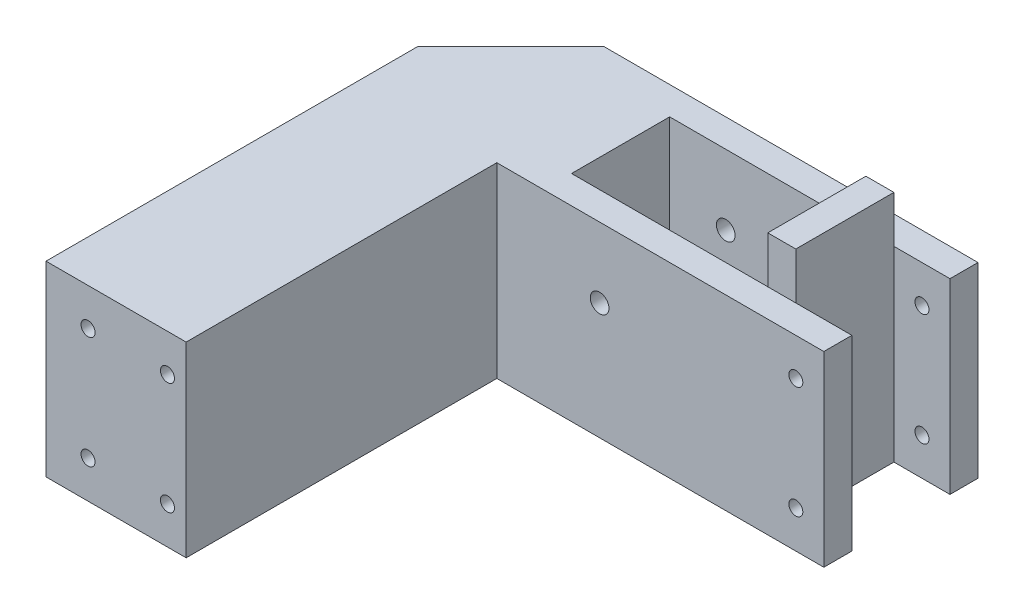
ISO-10303-21;
HEADER;
FILE_DESCRIPTION(('STEP AP214'),'2;1');
FILE_NAME('part.step','',(''),(''),'','','');
FILE_SCHEMA(('AUTOMOTIVE_DESIGN { 1 0 10303 214 1 1 1 1 }'));
ENDSEC;
DATA;
#1=APPLICATION_CONTEXT('core data for automotive mechanical design processes');
#2=APPLICATION_PROTOCOL_DEFINITION('international standard','automotive_design',2000,#1);
#3=PRODUCT_CONTEXT('',#1,'mechanical');
#4=PRODUCT('Part','Part','',(#3));
#5=PRODUCT_RELATED_PRODUCT_CATEGORY('part','',(#4));
#6=PRODUCT_DEFINITION_FORMATION('','',#4);
#7=PRODUCT_DEFINITION_CONTEXT('part definition',#1,'design');
#8=PRODUCT_DEFINITION('design','',#6,#7);
#9=PRODUCT_DEFINITION_SHAPE('','',#8);
#10=(LENGTH_UNIT() NAMED_UNIT(*) SI_UNIT(.MILLI.,.METRE.));
#11=(NAMED_UNIT(*) PLANE_ANGLE_UNIT() SI_UNIT($,.RADIAN.));
#12=(NAMED_UNIT(*) SI_UNIT($,.STERADIAN.) SOLID_ANGLE_UNIT());
#13=UNCERTAINTY_MEASURE_WITH_UNIT(LENGTH_MEASURE(1.E-05),#10,'distance_accuracy_value','');
#14=(GEOMETRIC_REPRESENTATION_CONTEXT(3) GLOBAL_UNCERTAINTY_ASSIGNED_CONTEXT((#13)) GLOBAL_UNIT_ASSIGNED_CONTEXT((#10,
#11,#12)) REPRESENTATION_CONTEXT('',''));
#15=CARTESIAN_POINT('',(0.,0.,0.));
#16=DIRECTION('',(0.,0.,1.));
#17=DIRECTION('',(1.,0.,0.));
#18=AXIS2_PLACEMENT_3D('',#15,#16,#17);
#19=CARTESIAN_POINT('',(20.,40.,-6.));
#20=DIRECTION('',(0.,0.,1.));
#21=DIRECTION('',(1.,0.,0.));
#22=AXIS2_PLACEMENT_3D('',#19,#20,#21);
#23=PLANE('',#22);
#24=CARTESIAN_POINT('',(32.,25.,-6.));
#25=DIRECTION('',(0.,0.,1.));
#26=DIRECTION('',(1.,0.,0.));
#27=AXIS2_PLACEMENT_3D('',#24,#25,#26);
#28=CIRCLE('',#27,2.);
#29=CARTESIAN_POINT('',(34.,25.,-6.));
#30=VERTEX_POINT('',#29);
#31=EDGE_CURVE('E188',#30,#30,#28,.T.);
#32=ORIENTED_EDGE('',*,*,#31,.T.);
#33=EDGE_LOOP('',(#32));
#34=FACE_BOUND('',#33,.T.);
#35=DIRECTION('',(0.,1.,0.));
#36=VECTOR('',#35,1.);
#37=CARTESIAN_POINT('',(62.,-21.8403296678416,-6.));
#38=LINE('',#37,#36);
#39=CARTESIAN_POINT('',(62.,0.,-6.));
#40=VERTEX_POINT('',#39);
#41=CARTESIAN_POINT('',(62.,40.,-6.));
#42=VERTEX_POINT('',#41);
#43=EDGE_CURVE('E175',#40,#42,#38,.T.);
#44=ORIENTED_EDGE('',*,*,#43,.F.);
#45=DIRECTION('',(-1.,0.,0.));
#46=VECTOR('',#45,1.);
#47=CARTESIAN_POINT('',(20.,0.,-6.));
#48=LINE('',#47,#46);
#49=CARTESIAN_POINT('',(20.,0.,-6.));
#50=VERTEX_POINT('',#49);
#51=EDGE_CURVE('E317',#40,#50,#48,.T.);
#52=ORIENTED_EDGE('',*,*,#51,.T.);
#53=DIRECTION('',(0.,-1.,0.));
#54=VECTOR('',#53,1.);
#55=CARTESIAN_POINT('',(20.,40.,-6.));
#56=LINE('',#55,#54);
#57=CARTESIAN_POINT('',(20.,40.,-6.));
#58=VERTEX_POINT('',#57);
#59=EDGE_CURVE('E337',#58,#50,#56,.T.);
#60=ORIENTED_EDGE('',*,*,#59,.F.);
#61=DIRECTION('',(-1.,0.,0.));
#62=VECTOR('',#61,1.);
#63=CARTESIAN_POINT('',(20.,40.,-6.));
#64=LINE('',#63,#62);
#65=EDGE_CURVE('E300',#42,#58,#64,.T.);
#66=ORIENTED_EDGE('',*,*,#65,.F.);
#67=EDGE_LOOP('',(#44,#52,#60,#66));
#68=FACE_BOUND('',#67,.T.);
#69=ADVANCED_FACE('F41',(#34,#68),#23,.F.);
#70=CARTESIAN_POINT('',(80.,40.,-27.0000000000001));
#71=DIRECTION('',(0.,0.,-1.));
#72=DIRECTION('',(-1.,0.,0.));
#73=AXIS2_PLACEMENT_3D('',#70,#71,#72);
#74=PLANE('',#73);
#75=CARTESIAN_POINT('',(74.,8.,-27.0000000000001));
#76=DIRECTION('',(0.,0.,-1.));
#77=DIRECTION('',(-1.,0.,0.));
#78=AXIS2_PLACEMENT_3D('',#75,#76,#77);
#79=CIRCLE('',#78,1.5);
#80=CARTESIAN_POINT('',(72.5,8.,-27.0000000000001));
#81=VERTEX_POINT('',#80);
#82=EDGE_CURVE('E279',#81,#81,#79,.T.);
#83=ORIENTED_EDGE('',*,*,#82,.T.);
#84=EDGE_LOOP('',(#83));
#85=FACE_BOUND('',#84,.T.);
#86=CARTESIAN_POINT('',(74.,32.,-27.0000000000001));
#87=DIRECTION('',(0.,0.,-1.));
#88=DIRECTION('',(-1.,0.,0.));
#89=AXIS2_PLACEMENT_3D('',#86,#87,#88);
#90=CIRCLE('',#89,1.5);
#91=CARTESIAN_POINT('',(72.5,32.,-27.0000000000001));
#92=VERTEX_POINT('',#91);
#93=EDGE_CURVE('E284',#92,#92,#90,.T.);
#94=ORIENTED_EDGE('',*,*,#93,.T.);
#95=EDGE_LOOP('',(#94));
#96=FACE_BOUND('',#95,.T.);
#97=DIRECTION('',(0.,1.,0.));
#98=VECTOR('',#97,1.);
#99=CARTESIAN_POINT('',(68.,-21.8403296678416,-27.0000000000001));
#100=LINE('',#99,#98);
#101=CARTESIAN_POINT('',(68.,0.,-27.0000000000001));
#102=VERTEX_POINT('',#101);
#103=CARTESIAN_POINT('',(68.,40.,-27.0000000000001));
#104=VERTEX_POINT('',#103);
#105=EDGE_CURVE('E206',#102,#104,#100,.T.);
#106=ORIENTED_EDGE('',*,*,#105,.F.);
#107=DIRECTION('',(1.,0.,0.));
#108=VECTOR('',#107,1.);
#109=CARTESIAN_POINT('',(80.,0.,-27.0000000000001));
#110=LINE('',#109,#108);
#111=CARTESIAN_POINT('',(80.,0.,-27.0000000000001));
#112=VERTEX_POINT('',#111);
#113=EDGE_CURVE('E323',#102,#112,#110,.T.);
#114=ORIENTED_EDGE('',*,*,#113,.T.);
#115=DIRECTION('',(0.,-1.,0.));
#116=VECTOR('',#115,1.);
#117=CARTESIAN_POINT('',(80.,40.,-27.0000000000001));
#118=LINE('',#117,#116);
#119=CARTESIAN_POINT('',(80.,40.,-27.0000000000001));
#120=VERTEX_POINT('',#119);
#121=EDGE_CURVE('E329',#120,#112,#118,.T.);
#122=ORIENTED_EDGE('',*,*,#121,.F.);
#123=DIRECTION('',(1.,0.,0.));
#124=VECTOR('',#123,1.);
#125=CARTESIAN_POINT('',(80.,40.,-27.0000000000001));
#126=LINE('',#125,#124);
#127=EDGE_CURVE('E303',#104,#120,#126,.T.);
#128=ORIENTED_EDGE('',*,*,#127,.F.);
#129=EDGE_LOOP('',(#106,#114,#122,#128));
#130=FACE_BOUND('',#129,.T.);
#131=ADVANCED_FACE('F376',(#85,#96,#130),#74,.F.);
#132=CARTESIAN_POINT('',(0.,40.,0.));
#133=DIRECTION('',(0.,0.,-1.));
#134=DIRECTION('',(-1.,0.,0.));
#135=AXIS2_PLACEMENT_3D('',#132,#133,#134);
#136=PLANE('',#135);
#137=CARTESIAN_POINT('',(32.,25.,0.));
#138=DIRECTION('',(0.,0.,1.));
#139=DIRECTION('',(1.,0.,0.));
#140=AXIS2_PLACEMENT_3D('',#137,#138,#139);
#141=CIRCLE('',#140,2.);
#142=CARTESIAN_POINT('',(34.,25.,0.));
#143=VERTEX_POINT('',#142);
#144=EDGE_CURVE('E620',#143,#143,#141,.T.);
#145=ORIENTED_EDGE('',*,*,#144,.F.);
#146=EDGE_LOOP('',(#145));
#147=FACE_BOUND('',#146,.T.);
#148=CARTESIAN_POINT('',(74.,32.,0.));
#149=DIRECTION('',(0.,0.,-1.));
#150=DIRECTION('',(-1.,0.,0.));
#151=AXIS2_PLACEMENT_3D('',#148,#149,#150);
#152=CIRCLE('',#151,1.5);
#153=CARTESIAN_POINT('',(72.5,32.,0.));
#154=VERTEX_POINT('',#153);
#155=EDGE_CURVE('E268',#154,#154,#152,.T.);
#156=ORIENTED_EDGE('',*,*,#155,.T.);
#157=EDGE_LOOP('',(#156));
#158=FACE_BOUND('',#157,.T.);
#159=CARTESIAN_POINT('',(74.,8.,0.));
#160=DIRECTION('',(0.,0.,-1.));
#161=DIRECTION('',(-1.,0.,0.));
#162=AXIS2_PLACEMENT_3D('',#159,#160,#161);
#163=CIRCLE('',#162,1.5);
#164=CARTESIAN_POINT('',(72.5,8.,0.));
#165=VERTEX_POINT('',#164);
#166=EDGE_CURVE('E274',#165,#165,#163,.T.);
#167=ORIENTED_EDGE('',*,*,#166,.T.);
#168=EDGE_LOOP('',(#167));
#169=FACE_BOUND('',#168,.T.);
#170=DIRECTION('',(1.,0.,0.));
#171=VECTOR('',#170,1.);
#172=CARTESIAN_POINT('',(0.,40.,0.));
#173=LINE('',#172,#171);
#174=CARTESIAN_POINT('',(10.,40.,0.));
#175=VERTEX_POINT('',#174);
#176=CARTESIAN_POINT('',(80.,40.,0.));
#177=VERTEX_POINT('',#176);
#178=EDGE_CURVE('E292',#175,#177,#173,.T.);
#179=ORIENTED_EDGE('',*,*,#178,.F.);
#180=DIRECTION('',(0.,-1.,0.));
#181=VECTOR('',#180,1.);
#182=CARTESIAN_POINT('',(10.,40.,0.));
#183=LINE('',#182,#181);
#184=CARTESIAN_POINT('',(10.,0.,0.));
#185=VERTEX_POINT('',#184);
#186=EDGE_CURVE('E11',#175,#185,#183,.T.);
#187=ORIENTED_EDGE('',*,*,#186,.T.);
#188=DIRECTION('',(1.,0.,0.));
#189=VECTOR('',#188,1.);
#190=CARTESIAN_POINT('',(0.,0.,0.));
#191=LINE('',#190,#189);
#192=CARTESIAN_POINT('',(80.,0.,0.));
#193=VERTEX_POINT('',#192);
#194=EDGE_CURVE('E293',#185,#193,#191,.T.);
#195=ORIENTED_EDGE('',*,*,#194,.T.);
#196=DIRECTION('',(0.,-1.,0.));
#197=VECTOR('',#196,1.);
#198=CARTESIAN_POINT('',(80.,40.,0.));
#199=LINE('',#198,#197);
#200=EDGE_CURVE('E49',#177,#193,#199,.T.);
#201=ORIENTED_EDGE('',*,*,#200,.F.);
#202=EDGE_LOOP('',(#179,#187,#195,#201));
#203=FACE_BOUND('',#202,.T.);
#204=ADVANCED_FACE('F43',(#147,#158,#169,#203),#136,.F.);
#205=CARTESIAN_POINT('',(80.,40.,-6.));
#206=DIRECTION('',(-1.,0.,0.));
#207=DIRECTION('',(0.,0.,1.));
#208=AXIS2_PLACEMENT_3D('',#205,#206,#207);
#209=PLANE('',#208);
#210=DIRECTION('',(0.,0.,-1.));
#211=VECTOR('',#210,1.);
#212=CARTESIAN_POINT('',(80.,0.,-6.));
#213=LINE('',#212,#211);
#214=CARTESIAN_POINT('',(80.,0.,-6.));
#215=VERTEX_POINT('',#214);
#216=EDGE_CURVE('E313',#193,#215,#213,.T.);
#217=ORIENTED_EDGE('',*,*,#216,.T.);
#218=DIRECTION('',(0.,-1.,0.));
#219=VECTOR('',#218,1.);
#220=CARTESIAN_POINT('',(80.,40.,-6.));
#221=LINE('',#220,#219);
#222=CARTESIAN_POINT('',(80.,40.,-6.));
#223=VERTEX_POINT('',#222);
#224=EDGE_CURVE('E339',#223,#215,#221,.T.);
#225=ORIENTED_EDGE('',*,*,#224,.F.);
#226=DIRECTION('',(0.,0.,-1.));
#227=VECTOR('',#226,1.);
#228=CARTESIAN_POINT('',(80.,40.,-6.));
#229=LINE('',#228,#227);
#230=EDGE_CURVE('E295',#177,#223,#229,.T.);
#231=ORIENTED_EDGE('',*,*,#230,.F.);
#232=ORIENTED_EDGE('',*,*,#200,.T.);
#233=EDGE_LOOP('',(#217,#225,#231,#232));
#234=FACE_BOUND('',#233,.T.);
#235=ADVANCED_FACE('F395',(#234),#209,.F.);
#236=CARTESIAN_POINT('',(74.,32.,-6.));
#237=DIRECTION('',(0.,0.,1.));
#238=DIRECTION('',(1.,0.,0.));
#239=AXIS2_PLACEMENT_3D('',#236,#237,#238);
#240=CIRCLE('',#239,1.5);
#241=CARTESIAN_POINT('',(75.5,32.,-6.));
#242=VERTEX_POINT('',#241);
#243=EDGE_CURVE('E286',#242,#242,#240,.T.);
#244=ORIENTED_EDGE('',*,*,#243,.T.);
#245=EDGE_LOOP('',(#244));
#246=FACE_BOUND('',#245,.T.);
#247=CARTESIAN_POINT('',(74.,8.,-6.));
#248=DIRECTION('',(0.,0.,1.));
#249=DIRECTION('',(1.,0.,0.));
#250=AXIS2_PLACEMENT_3D('',#247,#248,#249);
#251=CIRCLE('',#250,1.5);
#252=CARTESIAN_POINT('',(75.5,8.,-6.));
#253=VERTEX_POINT('',#252);
#254=EDGE_CURVE('E285',#253,#253,#251,.T.);
#255=ORIENTED_EDGE('',*,*,#254,.T.);
#256=EDGE_LOOP('',(#255));
#257=FACE_BOUND('',#256,.T.);
#258=CARTESIAN_POINT('',(68.,0.,-6.));
#259=VERTEX_POINT('',#258);
#260=EDGE_CURVE('E320',#215,#259,#48,.T.);
#261=ORIENTED_EDGE('',*,*,#260,.T.);
#262=DIRECTION('',(0.,1.,0.));
#263=VECTOR('',#262,1.);
#264=CARTESIAN_POINT('',(68.,-21.8403296678416,-6.));
#265=LINE('',#264,#263);
#266=CARTESIAN_POINT('',(68.,40.,-6.));
#267=VERTEX_POINT('',#266);
#268=EDGE_CURVE('E66',#259,#267,#265,.T.);
#269=ORIENTED_EDGE('',*,*,#268,.T.);
#270=EDGE_CURVE('E296',#223,#267,#64,.T.);
#271=ORIENTED_EDGE('',*,*,#270,.F.);
#272=ORIENTED_EDGE('',*,*,#224,.T.);
#273=EDGE_LOOP('',(#261,#269,#271,#272));
#274=FACE_BOUND('',#273,.T.);
#275=ADVANCED_FACE('F378',(#246,#257,#274),#23,.F.);
#276=CARTESIAN_POINT('',(20.,40.,-27.0000000000001));
#277=DIRECTION('',(-1.,0.,0.));
#278=DIRECTION('',(0.,0.,1.));
#279=AXIS2_PLACEMENT_3D('',#276,#277,#278);
#280=PLANE('',#279);
#281=DIRECTION('',(0.,0.,-1.));
#282=VECTOR('',#281,1.);
#283=CARTESIAN_POINT('',(20.,0.,-27.0000000000001));
#284=LINE('',#283,#282);
#285=CARTESIAN_POINT('',(20.,0.,-27.0000000000001));
#286=VERTEX_POINT('',#285);
#287=EDGE_CURVE('E316',#50,#286,#284,.T.);
#288=ORIENTED_EDGE('',*,*,#287,.T.);
#289=DIRECTION('',(0.,-1.,0.));
#290=VECTOR('',#289,1.);
#291=CARTESIAN_POINT('',(20.,40.,-27.0000000000001));
#292=LINE('',#291,#290);
#293=CARTESIAN_POINT('',(20.,40.,-27.0000000000001));
#294=VERTEX_POINT('',#293);
#295=EDGE_CURVE('E331',#294,#286,#292,.T.);
#296=ORIENTED_EDGE('',*,*,#295,.F.);
#297=DIRECTION('',(0.,0.,-1.));
#298=VECTOR('',#297,1.);
#299=CARTESIAN_POINT('',(20.,40.,-27.0000000000001));
#300=LINE('',#299,#298);
#301=EDGE_CURVE('E297',#58,#294,#300,.T.);
#302=ORIENTED_EDGE('',*,*,#301,.F.);
#303=ORIENTED_EDGE('',*,*,#59,.T.);
#304=EDGE_LOOP('',(#288,#296,#302,#303));
#305=FACE_BOUND('',#304,.T.);
#306=ADVANCED_FACE('F391',(#305),#280,.F.);
#307=CARTESIAN_POINT('',(32.,25.,-27.0000000000001));
#308=DIRECTION('',(0.,0.,-1.));
#309=DIRECTION('',(-1.,0.,0.));
#310=AXIS2_PLACEMENT_3D('',#307,#308,#309);
#311=CIRCLE('',#310,2.);
#312=CARTESIAN_POINT('',(30.,25.,-27.0000000000001));
#313=VERTEX_POINT('',#312);
#314=EDGE_CURVE('E192',#313,#313,#311,.T.);
#315=ORIENTED_EDGE('',*,*,#314,.T.);
#316=EDGE_LOOP('',(#315));
#317=FACE_BOUND('',#316,.T.);
#318=CARTESIAN_POINT('',(62.,0.,-27.0000000000001));
#319=VERTEX_POINT('',#318);
#320=EDGE_CURVE('E324',#286,#319,#110,.T.);
#321=ORIENTED_EDGE('',*,*,#320,.T.);
#322=DIRECTION('',(0.,1.,0.));
#323=VECTOR('',#322,1.);
#324=CARTESIAN_POINT('',(62.,-21.8403296678416,-27.0000000000001));
#325=LINE('',#324,#323);
#326=CARTESIAN_POINT('',(62.,40.,-27.0000000000001));
#327=VERTEX_POINT('',#326);
#328=EDGE_CURVE('E59',#319,#327,#325,.T.);
#329=ORIENTED_EDGE('',*,*,#328,.T.);
#330=EDGE_CURVE('E302',#294,#327,#126,.T.);
#331=ORIENTED_EDGE('',*,*,#330,.F.);
#332=ORIENTED_EDGE('',*,*,#295,.T.);
#333=EDGE_LOOP('',(#321,#329,#331,#332));
#334=FACE_BOUND('',#333,.T.);
#335=ADVANCED_FACE('F389',(#317,#334),#74,.F.);
#336=CARTESIAN_POINT('',(80.,40.,-33.0000000000001));
#337=DIRECTION('',(-1.,0.,0.));
#338=DIRECTION('',(0.,0.,1.));
#339=AXIS2_PLACEMENT_3D('',#336,#337,#338);
#340=PLANE('',#339);
#341=DIRECTION('',(0.,0.,-1.));
#342=VECTOR('',#341,1.);
#343=CARTESIAN_POINT('',(80.,0.,-33.0000000000001));
#344=LINE('',#343,#342);
#345=CARTESIAN_POINT('',(80.,0.,-33.0000000000001));
#346=VERTEX_POINT('',#345);
#347=EDGE_CURVE('E325',#112,#346,#344,.T.);
#348=ORIENTED_EDGE('',*,*,#347,.T.);
#349=DIRECTION('',(0.,-1.,0.));
#350=VECTOR('',#349,1.);
#351=CARTESIAN_POINT('',(80.,40.,-33.0000000000001));
#352=LINE('',#351,#350);
#353=CARTESIAN_POINT('',(80.,40.,-33.0000000000001));
#354=VERTEX_POINT('',#353);
#355=EDGE_CURVE('E315',#354,#346,#352,.T.);
#356=ORIENTED_EDGE('',*,*,#355,.F.);
#357=DIRECTION('',(0.,0.,-1.));
#358=VECTOR('',#357,1.);
#359=CARTESIAN_POINT('',(80.,40.,-33.0000000000001));
#360=LINE('',#359,#358);
#361=EDGE_CURVE('E306',#120,#354,#360,.T.);
#362=ORIENTED_EDGE('',*,*,#361,.F.);
#363=ORIENTED_EDGE('',*,*,#121,.T.);
#364=EDGE_LOOP('',(#348,#356,#362,#363));
#365=FACE_BOUND('',#364,.T.);
#366=ADVANCED_FACE('F457',(#365),#340,.F.);
#367=CARTESIAN_POINT('',(0.,40.,-33.0000000000001));
#368=DIRECTION('',(0.,0.,1.));
#369=DIRECTION('',(1.,0.,0.));
#370=AXIS2_PLACEMENT_3D('',#367,#368,#369);
#371=PLANE('',#370);
#372=CARTESIAN_POINT('',(32.,25.,-33.0000000000001));
#373=DIRECTION('',(0.,0.,1.));
#374=DIRECTION('',(1.,0.,0.));
#375=AXIS2_PLACEMENT_3D('',#372,#373,#374);
#376=CIRCLE('',#375,2.);
#377=CARTESIAN_POINT('',(34.,25.,-33.0000000000001));
#378=VERTEX_POINT('',#377);
#379=EDGE_CURVE('E625',#378,#378,#376,.T.);
#380=ORIENTED_EDGE('',*,*,#379,.T.);
#381=EDGE_LOOP('',(#380));
#382=FACE_BOUND('',#381,.T.);
#383=CARTESIAN_POINT('',(5.99999999999999,8.,-33.0000000000001));
#384=DIRECTION('',(0.,0.,-1.));
#385=DIRECTION('',(-1.,0.,0.));
#386=AXIS2_PLACEMENT_3D('',#383,#384,#385);
#387=CIRCLE('',#386,1.5);
#388=CARTESIAN_POINT('',(4.49999999999999,8.,-33.0000000000001));
#389=VERTEX_POINT('',#388);
#390=EDGE_CURVE('E258',#389,#389,#387,.T.);
#391=ORIENTED_EDGE('',*,*,#390,.F.);
#392=EDGE_LOOP('',(#391));
#393=FACE_BOUND('',#392,.T.);
#394=CARTESIAN_POINT('',(5.99999999999999,32.,-33.0000000000001));
#395=DIRECTION('',(0.,0.,-1.));
#396=DIRECTION('',(-1.,0.,0.));
#397=AXIS2_PLACEMENT_3D('',#394,#395,#396);
#398=CIRCLE('',#397,1.5);
#399=CARTESIAN_POINT('',(4.49999999999999,32.,-33.0000000000001));
#400=VERTEX_POINT('',#399);
#401=EDGE_CURVE('E267',#400,#400,#398,.T.);
#402=ORIENTED_EDGE('',*,*,#401,.F.);
#403=EDGE_LOOP('',(#402));
#404=FACE_BOUND('',#403,.T.);
#405=DIRECTION('',(-1.,0.,0.));
#406=VECTOR('',#405,1.);
#407=CARTESIAN_POINT('',(0.,0.,-33.0000000000001));
#408=LINE('',#407,#406);
#409=CARTESIAN_POINT('',(0.,0.,-33.0000000000001));
#410=VERTEX_POINT('',#409);
#411=EDGE_CURVE('E294',#346,#410,#408,.T.);
#412=ORIENTED_EDGE('',*,*,#411,.T.);
#413=DIRECTION('',(0.,1.,0.));
#414=VECTOR('',#413,1.);
#415=CARTESIAN_POINT('',(0.,0.,-33.0000000000001));
#416=LINE('',#415,#414);
#417=CARTESIAN_POINT('',(0.,40.,-33.0000000000001));
#418=VERTEX_POINT('',#417);
#419=EDGE_CURVE('E224',#410,#418,#416,.T.);
#420=ORIENTED_EDGE('',*,*,#419,.T.);
#421=DIRECTION('',(-1.,0.,0.));
#422=VECTOR('',#421,1.);
#423=CARTESIAN_POINT('',(0.,40.,-33.0000000000001));
#424=LINE('',#423,#422);
#425=EDGE_CURVE('E307',#354,#418,#424,.T.);
#426=ORIENTED_EDGE('',*,*,#425,.F.);
#427=ORIENTED_EDGE('',*,*,#355,.T.);
#428=EDGE_LOOP('',(#412,#420,#426,#427));
#429=FACE_BOUND('',#428,.T.);
#430=CARTESIAN_POINT('',(74.,8.,-33.0000000000001));
#431=DIRECTION('',(0.,0.,-1.));
#432=DIRECTION('',(-1.,0.,0.));
#433=AXIS2_PLACEMENT_3D('',#430,#431,#432);
#434=CIRCLE('',#433,1.5);
#435=CARTESIAN_POINT('',(72.5,8.,-33.0000000000001));
#436=VERTEX_POINT('',#435);
#437=EDGE_CURVE('E264',#436,#436,#434,.T.);
#438=ORIENTED_EDGE('',*,*,#437,.F.);
#439=EDGE_LOOP('',(#438));
#440=FACE_BOUND('',#439,.T.);
#441=CARTESIAN_POINT('',(74.,32.,-33.0000000000001));
#442=DIRECTION('',(0.,0.,-1.));
#443=DIRECTION('',(-1.,0.,0.));
#444=AXIS2_PLACEMENT_3D('',#441,#442,#443);
#445=CIRCLE('',#444,1.5);
#446=CARTESIAN_POINT('',(72.5,32.,-33.0000000000001));
#447=VERTEX_POINT('',#446);
#448=EDGE_CURVE('E265',#447,#447,#445,.T.);
#449=ORIENTED_EDGE('',*,*,#448,.F.);
#450=EDGE_LOOP('',(#449));
#451=FACE_BOUND('',#450,.T.);
#452=ADVANCED_FACE('F456',(#382,#393,#404,#429,#440,#451),#371,.F.);
#453=CARTESIAN_POINT('',(0.,40.,0.));
#454=DIRECTION('',(0.,1.,0.));
#455=DIRECTION('',(0.,0.,1.));
#456=AXIS2_PLACEMENT_3D('',#453,#454,#455);
#457=PLANE('',#456);
#458=DIRECTION('',(0.707106781186548,0.,-0.707106781186548));
#459=VECTOR('',#458,1.);
#460=CARTESIAN_POINT('',(0.,40.,-33.0000000000001));
#461=LINE('',#460,#459);
#462=CARTESIAN_POINT('',(-20.,40.,-13.0000000000001));
#463=VERTEX_POINT('',#462);
#464=EDGE_CURVE('E221',#463,#418,#461,.T.);
#465=ORIENTED_EDGE('',*,*,#464,.F.);
#466=DIRECTION('',(0.,0.,1.));
#467=VECTOR('',#466,1.);
#468=CARTESIAN_POINT('',(-20.,40.,-83.0000000000001));
#469=LINE('',#468,#467);
#470=CARTESIAN_POINT('',(-20.,40.,66.5));
#471=VERTEX_POINT('',#470);
#472=EDGE_CURVE('E260',#463,#471,#469,.T.);
#473=ORIENTED_EDGE('',*,*,#472,.T.);
#474=DIRECTION('',(-1.,0.,0.));
#475=VECTOR('',#474,1.);
#476=CARTESIAN_POINT('',(10.,40.,66.5));
#477=LINE('',#476,#475);
#478=CARTESIAN_POINT('',(10.,40.,66.5));
#479=VERTEX_POINT('',#478);
#480=EDGE_CURVE('E242',#479,#471,#477,.T.);
#481=ORIENTED_EDGE('',*,*,#480,.F.);
#482=DIRECTION('',(0.,0.,1.));
#483=VECTOR('',#482,1.);
#484=CARTESIAN_POINT('',(10.,40.,-83.0000000000001));
#485=LINE('',#484,#483);
#486=EDGE_CURVE('E254',#175,#479,#485,.T.);
#487=ORIENTED_EDGE('',*,*,#486,.F.);
#488=ORIENTED_EDGE('',*,*,#178,.T.);
#489=ORIENTED_EDGE('',*,*,#230,.T.);
#490=ORIENTED_EDGE('',*,*,#270,.T.);
#491=EDGE_CURVE('E301',#267,#42,#64,.T.);
#492=ORIENTED_EDGE('',*,*,#491,.T.);
#493=ORIENTED_EDGE('',*,*,#65,.T.);
#494=ORIENTED_EDGE('',*,*,#301,.T.);
#495=ORIENTED_EDGE('',*,*,#330,.T.);
#496=EDGE_CURVE('E310',#327,#104,#126,.T.);
#497=ORIENTED_EDGE('',*,*,#496,.T.);
#498=ORIENTED_EDGE('',*,*,#127,.T.);
#499=ORIENTED_EDGE('',*,*,#361,.T.);
#500=ORIENTED_EDGE('',*,*,#425,.T.);
#501=EDGE_LOOP('',(#465,#473,#481,#487,#488,#489,#490,#492,#493,#494,#495,#497,#498,#499,#500));
#502=FACE_BOUND('',#501,.T.);
#503=ADVANCED_FACE('F429',(#502),#457,.T.);
#504=CARTESIAN_POINT('',(0.,0.,0.));
#505=DIRECTION('',(0.,1.,0.));
#506=DIRECTION('',(0.,0.,1.));
#507=AXIS2_PLACEMENT_3D('',#504,#505,#506);
#508=PLANE('',#507);
#509=ORIENTED_EDGE('',*,*,#51,.F.);
#510=DIRECTION('',(0.,0.,-1.));
#511=VECTOR('',#510,1.);
#512=CARTESIAN_POINT('',(62.,0.,-27.0000000000001));
#513=LINE('',#512,#511);
#514=EDGE_CURVE('E205',#40,#319,#513,.T.);
#515=ORIENTED_EDGE('',*,*,#514,.T.);
#516=ORIENTED_EDGE('',*,*,#320,.F.);
#517=ORIENTED_EDGE('',*,*,#287,.F.);
#518=EDGE_LOOP('',(#509,#515,#516,#517));
#519=FACE_BOUND('',#518,.T.);
#520=DIRECTION('',(0.,0.,1.));
#521=VECTOR('',#520,1.);
#522=CARTESIAN_POINT('',(-20.,0.,-83.0000000000001));
#523=LINE('',#522,#521);
#524=CARTESIAN_POINT('',(-20.,0.,-13.0000000000001));
#525=VERTEX_POINT('',#524);
#526=CARTESIAN_POINT('',(-20.,0.,66.5));
#527=VERTEX_POINT('',#526);
#528=EDGE_CURVE('E259',#525,#527,#523,.T.);
#529=ORIENTED_EDGE('',*,*,#528,.F.);
#530=DIRECTION('',(0.707106781186548,0.,-0.707106781186548));
#531=VECTOR('',#530,1.);
#532=CARTESIAN_POINT('',(0.,0.,-33.0000000000001));
#533=LINE('',#532,#531);
#534=EDGE_CURVE('E217',#525,#410,#533,.T.);
#535=ORIENTED_EDGE('',*,*,#534,.T.);
#536=ORIENTED_EDGE('',*,*,#411,.F.);
#537=ORIENTED_EDGE('',*,*,#347,.F.);
#538=ORIENTED_EDGE('',*,*,#113,.F.);
#539=DIRECTION('',(0.,0.,1.));
#540=VECTOR('',#539,1.);
#541=CARTESIAN_POINT('',(68.,0.,-27.0000000000001));
#542=LINE('',#541,#540);
#543=EDGE_CURVE('E197',#102,#259,#542,.T.);
#544=ORIENTED_EDGE('',*,*,#543,.T.);
#545=ORIENTED_EDGE('',*,*,#260,.F.);
#546=ORIENTED_EDGE('',*,*,#216,.F.);
#547=ORIENTED_EDGE('',*,*,#194,.F.);
#548=DIRECTION('',(0.,0.,1.));
#549=VECTOR('',#548,1.);
#550=CARTESIAN_POINT('',(10.,0.,-83.0000000000001));
#551=LINE('',#550,#549);
#552=CARTESIAN_POINT('',(10.,0.,66.5));
#553=VERTEX_POINT('',#552);
#554=EDGE_CURVE('E251',#185,#553,#551,.T.);
#555=ORIENTED_EDGE('',*,*,#554,.T.);
#556=DIRECTION('',(1.,0.,0.));
#557=VECTOR('',#556,1.);
#558=CARTESIAN_POINT('',(10.,0.,66.5));
#559=LINE('',#558,#557);
#560=EDGE_CURVE('E249',#527,#553,#559,.T.);
#561=ORIENTED_EDGE('',*,*,#560,.F.);
#562=EDGE_LOOP('',(#529,#535,#536,#537,#538,#544,#545,#546,#547,#555,#561));
#563=FACE_BOUND('',#562,.T.);
#564=ADVANCED_FACE('F411',(#519,#563),#508,.F.);
#565=CARTESIAN_POINT('',(74.,8.,0.));
#566=DIRECTION('',(0.,0.,-1.));
#567=DIRECTION('',(-1.,0.,0.));
#568=AXIS2_PLACEMENT_3D('',#565,#566,#567);
#569=CYLINDRICAL_SURFACE('',#568,1.5);
#570=ORIENTED_EDGE('',*,*,#437,.T.);
#571=EDGE_LOOP('',(#570));
#572=FACE_BOUND('',#571,.T.);
#573=ORIENTED_EDGE('',*,*,#82,.F.);
#574=EDGE_LOOP('',(#573));
#575=FACE_BOUND('',#574,.T.);
#576=ADVANCED_FACE('F476',(#572,#575),#569,.F.);
#577=CARTESIAN_POINT('',(74.,32.,0.));
#578=DIRECTION('',(0.,0.,-1.));
#579=DIRECTION('',(-1.,0.,0.));
#580=AXIS2_PLACEMENT_3D('',#577,#578,#579);
#581=CYLINDRICAL_SURFACE('',#580,1.5);
#582=ORIENTED_EDGE('',*,*,#448,.T.);
#583=EDGE_LOOP('',(#582));
#584=FACE_BOUND('',#583,.T.);
#585=ORIENTED_EDGE('',*,*,#93,.F.);
#586=EDGE_LOOP('',(#585));
#587=FACE_BOUND('',#586,.T.);
#588=ADVANCED_FACE('F489',(#584,#587),#581,.F.);
#589=CARTESIAN_POINT('',(5.99999999999999,32.,0.));
#590=DIRECTION('',(0.,0.,-1.));
#591=DIRECTION('',(-1.,0.,0.));
#592=AXIS2_PLACEMENT_3D('',#589,#590,#591);
#593=CYLINDRICAL_SURFACE('',#592,1.5);
#594=ORIENTED_EDGE('',*,*,#401,.T.);
#595=EDGE_LOOP('',(#594));
#596=FACE_BOUND('',#595,.T.);
#597=CARTESIAN_POINT('',(5.99999999999999,32.,66.5));
#598=DIRECTION('',(0.,0.,1.));
#599=DIRECTION('',(1.,0.,0.));
#600=AXIS2_PLACEMENT_3D('',#597,#598,#599);
#601=CIRCLE('',#600,1.5);
#602=CARTESIAN_POINT('',(7.5,32.,66.5));
#603=VERTEX_POINT('',#602);
#604=EDGE_CURVE('E226',#603,#603,#601,.T.);
#605=ORIENTED_EDGE('',*,*,#604,.T.);
#606=EDGE_LOOP('',(#605));
#607=FACE_BOUND('',#606,.T.);
#608=ADVANCED_FACE('F488',(#596,#607),#593,.F.);
#609=CARTESIAN_POINT('',(5.99999999999999,8.,0.));
#610=DIRECTION('',(0.,0.,-1.));
#611=DIRECTION('',(-1.,0.,0.));
#612=AXIS2_PLACEMENT_3D('',#609,#610,#611);
#613=CYLINDRICAL_SURFACE('',#612,1.5);
#614=ORIENTED_EDGE('',*,*,#390,.T.);
#615=EDGE_LOOP('',(#614));
#616=FACE_BOUND('',#615,.T.);
#617=CARTESIAN_POINT('',(5.99999999999999,8.,66.5));
#618=DIRECTION('',(0.,0.,1.));
#619=DIRECTION('',(1.,0.,0.));
#620=AXIS2_PLACEMENT_3D('',#617,#618,#619);
#621=CIRCLE('',#620,1.5);
#622=CARTESIAN_POINT('',(7.49999999999999,8.,66.5));
#623=VERTEX_POINT('',#622);
#624=EDGE_CURVE('E235',#623,#623,#621,.T.);
#625=ORIENTED_EDGE('',*,*,#624,.T.);
#626=EDGE_LOOP('',(#625));
#627=FACE_BOUND('',#626,.T.);
#628=ADVANCED_FACE('F485',(#616,#627),#613,.F.);
#629=ORIENTED_EDGE('',*,*,#166,.F.);
#630=EDGE_LOOP('',(#629));
#631=FACE_BOUND('',#630,.T.);
#632=ORIENTED_EDGE('',*,*,#254,.F.);
#633=EDGE_LOOP('',(#632));
#634=FACE_BOUND('',#633,.T.);
#635=ADVANCED_FACE('F478',(#631,#634),#569,.F.);
#636=ORIENTED_EDGE('',*,*,#155,.F.);
#637=EDGE_LOOP('',(#636));
#638=FACE_BOUND('',#637,.T.);
#639=ORIENTED_EDGE('',*,*,#243,.F.);
#640=EDGE_LOOP('',(#639));
#641=FACE_BOUND('',#640,.T.);
#642=ADVANCED_FACE('F483',(#638,#641),#581,.F.);
#643=CARTESIAN_POINT('',(10.,0.,-83.0000000000001));
#644=DIRECTION('',(1.,0.,0.));
#645=DIRECTION('',(0.,0.,-1.));
#646=AXIS2_PLACEMENT_3D('',#643,#644,#645);
#647=PLANE('',#646);
#648=ORIENTED_EDGE('',*,*,#186,.F.);
#649=ORIENTED_EDGE('',*,*,#486,.T.);
#650=DIRECTION('',(0.,1.,0.));
#651=VECTOR('',#650,1.);
#652=CARTESIAN_POINT('',(10.,0.,66.5));
#653=LINE('',#652,#651);
#654=EDGE_CURVE('E241',#553,#479,#653,.T.);
#655=ORIENTED_EDGE('',*,*,#654,.F.);
#656=ORIENTED_EDGE('',*,*,#554,.F.);
#657=EDGE_LOOP('',(#648,#649,#655,#656));
#658=FACE_BOUND('',#657,.T.);
#659=ADVANCED_FACE('F438',(#658),#647,.T.);
#660=CARTESIAN_POINT('',(-20.,0.,-83.0000000000001));
#661=DIRECTION('',(-1.,0.,0.));
#662=DIRECTION('',(0.,0.,1.));
#663=AXIS2_PLACEMENT_3D('',#660,#661,#662);
#664=PLANE('',#663);
#665=DIRECTION('',(0.,1.,0.));
#666=VECTOR('',#665,1.);
#667=CARTESIAN_POINT('',(-20.,0.,-13.0000000000001));
#668=LINE('',#667,#666);
#669=EDGE_CURVE('E225',#525,#463,#668,.T.);
#670=ORIENTED_EDGE('',*,*,#669,.F.);
#671=ORIENTED_EDGE('',*,*,#528,.T.);
#672=DIRECTION('',(0.,-1.,0.));
#673=VECTOR('',#672,1.);
#674=CARTESIAN_POINT('',(-20.,0.,66.5));
#675=LINE('',#674,#673);
#676=EDGE_CURVE('E250',#471,#527,#675,.T.);
#677=ORIENTED_EDGE('',*,*,#676,.F.);
#678=ORIENTED_EDGE('',*,*,#472,.F.);
#679=EDGE_LOOP('',(#670,#671,#677,#678));
#680=FACE_BOUND('',#679,.T.);
#681=ADVANCED_FACE('F446',(#680),#664,.T.);
#682=CARTESIAN_POINT('',(-11.,32.,-83.0000000000001));
#683=DIRECTION('',(0.,0.,1.));
#684=DIRECTION('',(1.,0.,0.));
#685=AXIS2_PLACEMENT_3D('',#682,#683,#684);
#686=CYLINDRICAL_SURFACE('',#685,1.5);
#687=CARTESIAN_POINT('',(-11.,32.,16.5));
#688=DIRECTION('',(0.,0.,1.));
#689=DIRECTION('',(1.,0.,0.));
#690=AXIS2_PLACEMENT_3D('',#687,#688,#689);
#691=CIRCLE('',#690,1.5);
#692=CARTESIAN_POINT('',(-9.50000000000001,32.,16.5));
#693=VERTEX_POINT('',#692);
#694=EDGE_CURVE('E44',#693,#693,#691,.F.);
#695=ORIENTED_EDGE('',*,*,#694,.T.);
#696=EDGE_LOOP('',(#695));
#697=FACE_BOUND('',#696,.T.);
#698=CARTESIAN_POINT('',(-11.,32.,66.5));
#699=DIRECTION('',(0.,0.,1.));
#700=DIRECTION('',(1.,0.,0.));
#701=AXIS2_PLACEMENT_3D('',#698,#699,#700);
#702=CIRCLE('',#701,1.5);
#703=CARTESIAN_POINT('',(-9.50000000000001,32.,66.5));
#704=VERTEX_POINT('',#703);
#705=EDGE_CURVE('E238',#704,#704,#702,.T.);
#706=ORIENTED_EDGE('',*,*,#705,.T.);
#707=EDGE_LOOP('',(#706));
#708=FACE_BOUND('',#707,.T.);
#709=ADVANCED_FACE('F354',(#697,#708),#686,.F.);
#710=CARTESIAN_POINT('',(-11.,8.,-83.0000000000001));
#711=DIRECTION('',(0.,0.,1.));
#712=DIRECTION('',(1.,0.,0.));
#713=AXIS2_PLACEMENT_3D('',#710,#711,#712);
#714=CYLINDRICAL_SURFACE('',#713,1.5);
#715=CARTESIAN_POINT('',(-11.,8.,16.5));
#716=DIRECTION('',(0.,0.,1.));
#717=DIRECTION('',(1.,0.,0.));
#718=AXIS2_PLACEMENT_3D('',#715,#716,#717);
#719=CIRCLE('',#718,1.5);
#720=CARTESIAN_POINT('',(-9.50000000000001,8.,16.5));
#721=VERTEX_POINT('',#720);
#722=EDGE_CURVE('E348',#721,#721,#719,.F.);
#723=ORIENTED_EDGE('',*,*,#722,.T.);
#724=EDGE_LOOP('',(#723));
#725=FACE_BOUND('',#724,.T.);
#726=CARTESIAN_POINT('',(-11.,8.,66.5));
#727=DIRECTION('',(0.,0.,1.));
#728=DIRECTION('',(1.,0.,0.));
#729=AXIS2_PLACEMENT_3D('',#726,#727,#728);
#730=CIRCLE('',#729,1.5);
#731=CARTESIAN_POINT('',(-9.50000000000001,8.,66.5));
#732=VERTEX_POINT('',#731);
#733=EDGE_CURVE('E232',#732,#732,#730,.T.);
#734=ORIENTED_EDGE('',*,*,#733,.T.);
#735=EDGE_LOOP('',(#734));
#736=FACE_BOUND('',#735,.T.);
#737=ADVANCED_FACE('F501',(#725,#736),#714,.F.);
#738=CARTESIAN_POINT('',(0.,0.,66.5));
#739=DIRECTION('',(0.,0.,1.));
#740=DIRECTION('',(1.,0.,0.));
#741=AXIS2_PLACEMENT_3D('',#738,#739,#740);
#742=PLANE('',#741);
#743=ORIENTED_EDGE('',*,*,#624,.F.);
#744=EDGE_LOOP('',(#743));
#745=FACE_BOUND('',#744,.T.);
#746=ORIENTED_EDGE('',*,*,#705,.F.);
#747=EDGE_LOOP('',(#746));
#748=FACE_BOUND('',#747,.T.);
#749=ORIENTED_EDGE('',*,*,#654,.T.);
#750=ORIENTED_EDGE('',*,*,#480,.T.);
#751=ORIENTED_EDGE('',*,*,#676,.T.);
#752=ORIENTED_EDGE('',*,*,#560,.T.);
#753=EDGE_LOOP('',(#749,#750,#751,#752));
#754=FACE_BOUND('',#753,.T.);
#755=ORIENTED_EDGE('',*,*,#733,.F.);
#756=EDGE_LOOP('',(#755));
#757=FACE_BOUND('',#756,.T.);
#758=ORIENTED_EDGE('',*,*,#604,.F.);
#759=EDGE_LOOP('',(#758));
#760=FACE_BOUND('',#759,.T.);
#761=ADVANCED_FACE('F443',(#745,#748,#754,#757,#760),#742,.T.);
#762=CARTESIAN_POINT('',(0.,0.,-33.0000000000001));
#763=DIRECTION('',(0.707106781186548,0.,0.707106781186548));
#764=DIRECTION('',(0.707106781186548,0.,-0.707106781186548));
#765=AXIS2_PLACEMENT_3D('',#762,#763,#764);
#766=PLANE('',#765);
#767=CARTESIAN_POINT('',(-11.,32.,-22.0000000000001));
#768=DIRECTION('',(0.707106781186548,0.,0.707106781186548));
#769=DIRECTION('',(-0.707106781186548,0.,0.707106781186548));
#770=AXIS2_PLACEMENT_3D('',#767,#768,#769);
#771=ELLIPSE('',#770,4.94974746830583,3.5);
#772=CARTESIAN_POINT('',(-14.5,32.,-18.5000000000001));
#773=VERTEX_POINT('',#772);
#774=EDGE_CURVE('E346',#773,#773,#771,.T.);
#775=ORIENTED_EDGE('',*,*,#774,.T.);
#776=EDGE_LOOP('',(#775));
#777=FACE_BOUND('',#776,.T.);
#778=CARTESIAN_POINT('',(-11.,8.,-22.0000000000001));
#779=DIRECTION('',(0.707106781186548,0.,0.707106781186548));
#780=DIRECTION('',(-0.707106781186548,0.,0.707106781186548));
#781=AXIS2_PLACEMENT_3D('',#778,#779,#780);
#782=ELLIPSE('',#781,4.94974746830583,3.5);
#783=CARTESIAN_POINT('',(-14.5,8.,-18.5000000000001));
#784=VERTEX_POINT('',#783);
#785=EDGE_CURVE('E216',#784,#784,#782,.T.);
#786=ORIENTED_EDGE('',*,*,#785,.T.);
#787=EDGE_LOOP('',(#786));
#788=FACE_BOUND('',#787,.T.);
#789=ORIENTED_EDGE('',*,*,#464,.T.);
#790=ORIENTED_EDGE('',*,*,#419,.F.);
#791=ORIENTED_EDGE('',*,*,#534,.F.);
#792=ORIENTED_EDGE('',*,*,#669,.T.);
#793=EDGE_LOOP('',(#789,#790,#791,#792));
#794=FACE_BOUND('',#793,.T.);
#795=ADVANCED_FACE('F453',(#777,#788,#794),#766,.F.);
#796=CARTESIAN_POINT('',(-11.,8.,16.5));
#797=DIRECTION('',(0.,0.,1.));
#798=DIRECTION('',(1.,0.,0.));
#799=AXIS2_PLACEMENT_3D('',#796,#797,#798);
#800=PLANE('',#799);
#801=CARTESIAN_POINT('',(-11.,8.,16.5));
#802=DIRECTION('',(0.,0.,1.));
#803=DIRECTION('',(1.,0.,0.));
#804=AXIS2_PLACEMENT_3D('',#801,#802,#803);
#805=CIRCLE('',#804,3.5);
#806=CARTESIAN_POINT('',(-7.50000000000001,8.,16.5));
#807=VERTEX_POINT('',#806);
#808=EDGE_CURVE('E204',#807,#807,#805,.T.);
#809=ORIENTED_EDGE('',*,*,#808,.F.);
#810=EDGE_LOOP('',(#809));
#811=FACE_BOUND('',#810,.T.);
#812=ORIENTED_EDGE('',*,*,#722,.F.);
#813=EDGE_LOOP('',(#812));
#814=FACE_BOUND('',#813,.T.);
#815=ADVANCED_FACE('F369',(#811,#814),#800,.F.);
#816=CARTESIAN_POINT('',(-11.,8.,-33.0000000000001));
#817=DIRECTION('',(0.,0.,1.));
#818=DIRECTION('',(1.,0.,0.));
#819=AXIS2_PLACEMENT_3D('',#816,#817,#818);
#820=CYLINDRICAL_SURFACE('',#819,3.5);
#821=ORIENTED_EDGE('',*,*,#808,.T.);
#822=EDGE_LOOP('',(#821));
#823=FACE_BOUND('',#822,.T.);
#824=ORIENTED_EDGE('',*,*,#785,.F.);
#825=EDGE_LOOP('',(#824));
#826=FACE_BOUND('',#825,.T.);
#827=ADVANCED_FACE('F363',(#823,#826),#820,.F.);
#828=CARTESIAN_POINT('',(-11.,32.,16.5));
#829=DIRECTION('',(0.,0.,1.));
#830=DIRECTION('',(1.,0.,0.));
#831=AXIS2_PLACEMENT_3D('',#828,#829,#830);
#832=PLANE('',#831);
#833=CARTESIAN_POINT('',(-11.,32.,16.5));
#834=DIRECTION('',(0.,0.,1.));
#835=DIRECTION('',(1.,0.,0.));
#836=AXIS2_PLACEMENT_3D('',#833,#834,#835);
#837=CIRCLE('',#836,3.5);
#838=CARTESIAN_POINT('',(-7.50000000000001,32.,16.5));
#839=VERTEX_POINT('',#838);
#840=EDGE_CURVE('E212',#839,#839,#837,.T.);
#841=ORIENTED_EDGE('',*,*,#840,.F.);
#842=EDGE_LOOP('',(#841));
#843=FACE_BOUND('',#842,.T.);
#844=ORIENTED_EDGE('',*,*,#694,.F.);
#845=EDGE_LOOP('',(#844));
#846=FACE_BOUND('',#845,.T.);
#847=ADVANCED_FACE('F356',(#843,#846),#832,.F.);
#848=CARTESIAN_POINT('',(-11.,32.,-33.0000000000001));
#849=DIRECTION('',(0.,0.,1.));
#850=DIRECTION('',(1.,0.,0.));
#851=AXIS2_PLACEMENT_3D('',#848,#849,#850);
#852=CYLINDRICAL_SURFACE('',#851,3.5);
#853=ORIENTED_EDGE('',*,*,#840,.T.);
#854=EDGE_LOOP('',(#853));
#855=FACE_BOUND('',#854,.T.);
#856=ORIENTED_EDGE('',*,*,#774,.F.);
#857=EDGE_LOOP('',(#856));
#858=FACE_BOUND('',#857,.T.);
#859=ADVANCED_FACE('F359',(#855,#858),#852,.F.);
#860=CARTESIAN_POINT('',(62.,-21.8403296678416,-6.));
#861=DIRECTION('',(0.,0.,1.));
#862=DIRECTION('',(1.,0.,0.));
#863=AXIS2_PLACEMENT_3D('',#860,#861,#862);
#864=PLANE('',#863);
#865=ORIENTED_EDGE('',*,*,#491,.F.);
#866=CARTESIAN_POINT('',(68.,50.,-6.));
#867=VERTEX_POINT('',#866);
#868=EDGE_CURVE('E181',#267,#867,#265,.T.);
#869=ORIENTED_EDGE('',*,*,#868,.T.);
#870=DIRECTION('',(1.,0.,0.));
#871=VECTOR('',#870,1.);
#872=CARTESIAN_POINT('',(62.,50.,-6.));
#873=LINE('',#872,#871);
#874=CARTESIAN_POINT('',(62.,50.,-6.));
#875=VERTEX_POINT('',#874);
#876=EDGE_CURVE('E178',#875,#867,#873,.T.);
#877=ORIENTED_EDGE('',*,*,#876,.F.);
#878=EDGE_CURVE('E164',#42,#875,#38,.T.);
#879=ORIENTED_EDGE('',*,*,#878,.F.);
#880=EDGE_LOOP('',(#865,#869,#877,#879));
#881=FACE_BOUND('',#880,.T.);
#882=ADVANCED_FACE('F177',(#881),#864,.T.);
#883=CARTESIAN_POINT('',(62.,-21.8403296678416,-27.0000000000001));
#884=DIRECTION('',(0.,0.,-1.));
#885=DIRECTION('',(-1.,0.,0.));
#886=AXIS2_PLACEMENT_3D('',#883,#884,#885);
#887=PLANE('',#886);
#888=ORIENTED_EDGE('',*,*,#496,.F.);
#889=CARTESIAN_POINT('',(62.,50.,-27.0000000000001));
#890=VERTEX_POINT('',#889);
#891=EDGE_CURVE('E210',#327,#890,#325,.T.);
#892=ORIENTED_EDGE('',*,*,#891,.T.);
#893=DIRECTION('',(-1.,0.,0.));
#894=VECTOR('',#893,1.);
#895=CARTESIAN_POINT('',(62.,50.,-27.0000000000001));
#896=LINE('',#895,#894);
#897=CARTESIAN_POINT('',(68.,50.,-27.0000000000001));
#898=VERTEX_POINT('',#897);
#899=EDGE_CURVE('E174',#898,#890,#896,.T.);
#900=ORIENTED_EDGE('',*,*,#899,.F.);
#901=EDGE_CURVE('E213',#104,#898,#100,.T.);
#902=ORIENTED_EDGE('',*,*,#901,.F.);
#903=EDGE_LOOP('',(#888,#892,#900,#902));
#904=FACE_BOUND('',#903,.T.);
#905=ADVANCED_FACE('F416',(#904),#887,.T.);
#906=CARTESIAN_POINT('',(62.,-21.8403296678416,-27.0000000000001));
#907=DIRECTION('',(-1.,0.,0.));
#908=DIRECTION('',(0.,0.,1.));
#909=AXIS2_PLACEMENT_3D('',#906,#907,#908);
#910=PLANE('',#909);
#911=ORIENTED_EDGE('',*,*,#514,.F.);
#912=ORIENTED_EDGE('',*,*,#43,.T.);
#913=ORIENTED_EDGE('',*,*,#878,.T.);
#914=DIRECTION('',(0.,0.,1.));
#915=VECTOR('',#914,1.);
#916=CARTESIAN_POINT('',(62.,50.,-27.0000000000001));
#917=LINE('',#916,#915);
#918=EDGE_CURVE('E171',#890,#875,#917,.T.);
#919=ORIENTED_EDGE('',*,*,#918,.F.);
#920=ORIENTED_EDGE('',*,*,#891,.F.);
#921=ORIENTED_EDGE('',*,*,#328,.F.);
#922=EDGE_LOOP('',(#911,#912,#913,#919,#920,#921));
#923=FACE_BOUND('',#922,.T.);
#924=ADVANCED_FACE('F166',(#923),#910,.T.);
#925=CARTESIAN_POINT('',(68.,-21.8403296678416,-27.0000000000001));
#926=DIRECTION('',(1.,0.,0.));
#927=DIRECTION('',(0.,0.,-1.));
#928=AXIS2_PLACEMENT_3D('',#925,#926,#927);
#929=PLANE('',#928);
#930=ORIENTED_EDGE('',*,*,#543,.F.);
#931=ORIENTED_EDGE('',*,*,#105,.T.);
#932=ORIENTED_EDGE('',*,*,#901,.T.);
#933=DIRECTION('',(0.,0.,-1.));
#934=VECTOR('',#933,1.);
#935=CARTESIAN_POINT('',(68.,50.,-27.0000000000001));
#936=LINE('',#935,#934);
#937=EDGE_CURVE('E184',#867,#898,#936,.T.);
#938=ORIENTED_EDGE('',*,*,#937,.F.);
#939=ORIENTED_EDGE('',*,*,#868,.F.);
#940=ORIENTED_EDGE('',*,*,#268,.F.);
#941=EDGE_LOOP('',(#930,#931,#932,#938,#939,#940));
#942=FACE_BOUND('',#941,.T.);
#943=ADVANCED_FACE('F412',(#942),#929,.T.);
#944=CARTESIAN_POINT('',(0.,50.,0.));
#945=DIRECTION('',(0.,1.,0.));
#946=DIRECTION('',(0.,0.,1.));
#947=AXIS2_PLACEMENT_3D('',#944,#945,#946);
#948=PLANE('',#947);
#949=ORIENTED_EDGE('',*,*,#918,.T.);
#950=ORIENTED_EDGE('',*,*,#876,.T.);
#951=ORIENTED_EDGE('',*,*,#937,.T.);
#952=ORIENTED_EDGE('',*,*,#899,.T.);
#953=EDGE_LOOP('',(#949,#950,#951,#952));
#954=FACE_BOUND('',#953,.T.);
#955=ADVANCED_FACE('F189',(#954),#948,.T.);
#956=CARTESIAN_POINT('',(32.,25.,-33.0000000000001));
#957=DIRECTION('',(0.,0.,1.));
#958=DIRECTION('',(1.,0.,0.));
#959=AXIS2_PLACEMENT_3D('',#956,#957,#958);
#960=CYLINDRICAL_SURFACE('',#959,2.);
#961=ORIENTED_EDGE('',*,*,#379,.F.);
#962=EDGE_LOOP('',(#961));
#963=FACE_BOUND('',#962,.T.);
#964=ORIENTED_EDGE('',*,*,#314,.F.);
#965=EDGE_LOOP('',(#964));
#966=FACE_BOUND('',#965,.T.);
#967=ADVANCED_FACE('F594',(#963,#966),#960,.F.);
#968=ORIENTED_EDGE('',*,*,#144,.T.);
#969=EDGE_LOOP('',(#968));
#970=FACE_BOUND('',#969,.T.);
#971=ORIENTED_EDGE('',*,*,#31,.F.);
#972=EDGE_LOOP('',(#971));
#973=FACE_BOUND('',#972,.T.);
#974=ADVANCED_FACE('F605',(#970,#973),#960,.F.);
#975=CLOSED_SHELL('',(#69,#131,#204,#235,#275,#306,#335,#366,#452,#503,#564,#576,#588,#608,#628,
#635,#642,#659,#681,#709,#737,#761,#795,#815,#827,#847,#859,#882,#905,#924,#943,#955,#967,#974));
#976=MANIFOLD_SOLID_BREP('B2',#975);
#977=ADVANCED_BREP_SHAPE_REPRESENTATION('',(#18,#976),#14);
#978=SHAPE_DEFINITION_REPRESENTATION(#9,#977);
ENDSEC;
END-ISO-10303-21;
